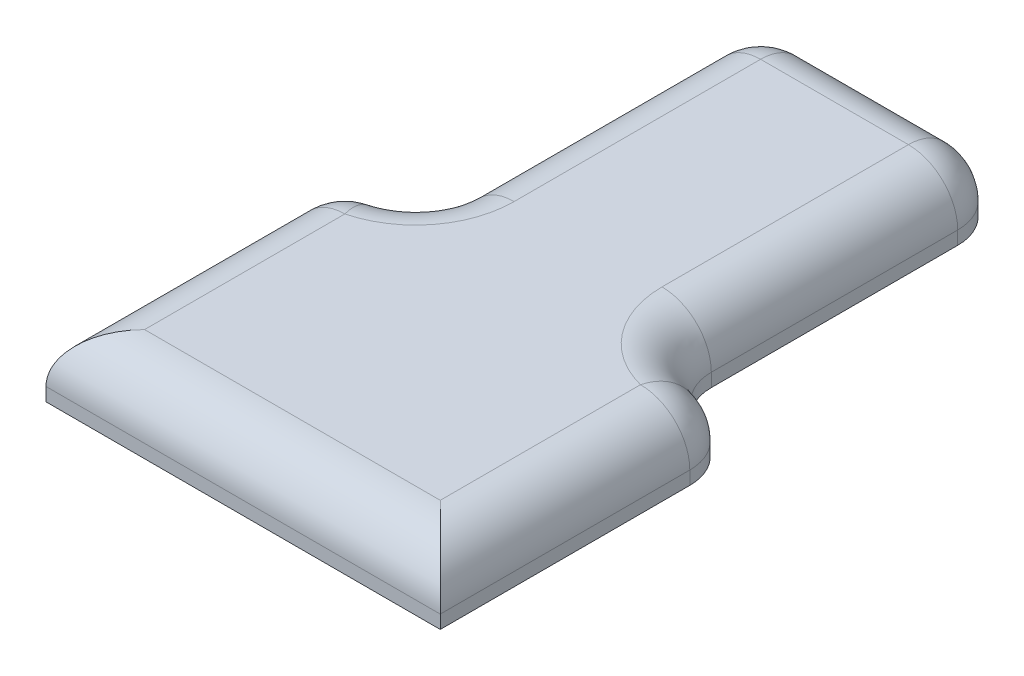
ISO-10303-21;
HEADER;
FILE_DESCRIPTION(('STEP AP214'),'2;1');
FILE_NAME('part.step','',(''),(''),'','','');
FILE_SCHEMA(('AUTOMOTIVE_DESIGN { 1 0 10303 214 1 1 1 1 }'));
ENDSEC;
DATA;
#1=APPLICATION_CONTEXT('core data for automotive mechanical design processes');
#2=APPLICATION_PROTOCOL_DEFINITION('international standard','automotive_design',2000,#1);
#3=PRODUCT_CONTEXT('',#1,'mechanical');
#4=PRODUCT('Part','Part','',(#3));
#5=PRODUCT_RELATED_PRODUCT_CATEGORY('part','',(#4));
#6=PRODUCT_DEFINITION_FORMATION('','',#4);
#7=PRODUCT_DEFINITION_CONTEXT('part definition',#1,'design');
#8=PRODUCT_DEFINITION('design','',#6,#7);
#9=PRODUCT_DEFINITION_SHAPE('','',#8);
#10=(LENGTH_UNIT() NAMED_UNIT(*) SI_UNIT(.MILLI.,.METRE.));
#11=(NAMED_UNIT(*) PLANE_ANGLE_UNIT() SI_UNIT($,.RADIAN.));
#12=(NAMED_UNIT(*) SI_UNIT($,.STERADIAN.) SOLID_ANGLE_UNIT());
#13=UNCERTAINTY_MEASURE_WITH_UNIT(LENGTH_MEASURE(1.E-05),#10,'distance_accuracy_value','');
#14=(GEOMETRIC_REPRESENTATION_CONTEXT(3) GLOBAL_UNCERTAINTY_ASSIGNED_CONTEXT((#13)) GLOBAL_UNIT_ASSIGNED_CONTEXT((#10,
#11,#12)) REPRESENTATION_CONTEXT('',''));
#15=CARTESIAN_POINT('',(0.,0.,0.));
#16=DIRECTION('',(0.,0.,1.));
#17=DIRECTION('',(1.,0.,0.));
#18=AXIS2_PLACEMENT_3D('',#15,#16,#17);
#19=CARTESIAN_POINT('',(15.,2.7,-90.));
#20=DIRECTION('',(0.,0.,1.));
#21=DIRECTION('',(1.,0.,0.));
#22=AXIS2_PLACEMENT_3D('',#19,#20,#21);
#23=SPHERICAL_SURFACE('',#22,10.);
#24=CARTESIAN_POINT('',(15.,2.7,-90.));
#25=DIRECTION('',(0.,-1.,0.));
#26=DIRECTION('',(0.,0.,-1.));
#27=AXIS2_PLACEMENT_3D('',#24,#25,#26);
#28=CIRCLE('',#27,10.);
#29=CARTESIAN_POINT('',(15.,2.7,-100.));
#30=VERTEX_POINT('',#29);
#31=CARTESIAN_POINT('',(25.,2.7,-90.));
#32=VERTEX_POINT('',#31);
#33=EDGE_CURVE('E11',#30,#32,#28,.T.);
#34=ORIENTED_EDGE('',*,*,#33,.F.);
#35=CARTESIAN_POINT('',(15.,2.7,-90.));
#36=DIRECTION('',(1.,0.,0.));
#37=DIRECTION('',(0.,0.,-1.));
#38=AXIS2_PLACEMENT_3D('',#35,#36,#37);
#39=CIRCLE('',#38,10.);
#40=CARTESIAN_POINT('',(15.,12.7,-90.));
#41=VERTEX_POINT('',#40);
#42=EDGE_CURVE('E41',#30,#41,#39,.T.);
#43=ORIENTED_EDGE('',*,*,#42,.T.);
#44=CARTESIAN_POINT('',(15.,2.7,-90.));
#45=DIRECTION('',(0.,0.,-1.));
#46=DIRECTION('',(-1.,0.,0.));
#47=AXIS2_PLACEMENT_3D('',#44,#45,#46);
#48=CIRCLE('',#47,10.);
#49=EDGE_CURVE('E293',#32,#41,#48,.F.);
#50=ORIENTED_EDGE('',*,*,#49,.F.);
#51=EDGE_LOOP('',(#34,#43,#50));
#52=FACE_BOUND('',#51,.T.);
#53=ADVANCED_FACE('F33',(#52),#23,.T.);
#54=CARTESIAN_POINT('',(-25.,2.7,-90.));
#55=DIRECTION('',(-1.,0.,0.));
#56=DIRECTION('',(0.,0.,1.));
#57=AXIS2_PLACEMENT_3D('',#54,#55,#56);
#58=CYLINDRICAL_SURFACE('',#57,10.);
#59=ORIENTED_EDGE('',*,*,#42,.F.);
#60=DIRECTION('',(1.,0.,0.));
#61=VECTOR('',#60,1.);
#62=CARTESIAN_POINT('',(-25.,2.7,-100.));
#63=LINE('',#62,#61);
#64=CARTESIAN_POINT('',(-15.,2.7,-100.));
#65=VERTEX_POINT('',#64);
#66=EDGE_CURVE('E273',#65,#30,#63,.T.);
#67=ORIENTED_EDGE('',*,*,#66,.F.);
#68=CARTESIAN_POINT('',(-15.,2.7,-90.));
#69=DIRECTION('',(1.,0.,0.));
#70=DIRECTION('',(0.,0.,-1.));
#71=AXIS2_PLACEMENT_3D('',#68,#69,#70);
#72=CIRCLE('',#71,10.);
#73=CARTESIAN_POINT('',(-15.,12.7,-90.));
#74=VERTEX_POINT('',#73);
#75=EDGE_CURVE('E299',#65,#74,#72,.T.);
#76=ORIENTED_EDGE('',*,*,#75,.T.);
#77=DIRECTION('',(1.,0.,0.));
#78=VECTOR('',#77,1.);
#79=CARTESIAN_POINT('',(-25.,12.7,-90.));
#80=LINE('',#79,#78);
#81=EDGE_CURVE('E290',#41,#74,#80,.F.);
#82=ORIENTED_EDGE('',*,*,#81,.F.);
#83=EDGE_LOOP('',(#59,#67,#76,#82));
#84=FACE_BOUND('',#83,.T.);
#85=ADVANCED_FACE('F303',(#84),#58,.T.);
#86=CARTESIAN_POINT('',(-15.,2.7,-90.));
#87=DIRECTION('',(0.,0.,1.));
#88=DIRECTION('',(1.,0.,0.));
#89=AXIS2_PLACEMENT_3D('',#86,#87,#88);
#90=SPHERICAL_SURFACE('',#89,10.);
#91=ORIENTED_EDGE('',*,*,#75,.F.);
#92=CARTESIAN_POINT('',(-15.,2.7,-90.));
#93=DIRECTION('',(0.,1.,0.));
#94=DIRECTION('',(0.,0.,1.));
#95=AXIS2_PLACEMENT_3D('',#92,#93,#94);
#96=CIRCLE('',#95,10.);
#97=CARTESIAN_POINT('',(-25.,2.7,-90.));
#98=VERTEX_POINT('',#97);
#99=EDGE_CURVE('E297',#65,#98,#96,.T.);
#100=ORIENTED_EDGE('',*,*,#99,.T.);
#101=CARTESIAN_POINT('',(-15.,2.7,-90.));
#102=DIRECTION('',(0.,0.,1.));
#103=DIRECTION('',(1.,0.,0.));
#104=AXIS2_PLACEMENT_3D('',#101,#102,#103);
#105=CIRCLE('',#104,10.);
#106=EDGE_CURVE('E287',#74,#98,#105,.T.);
#107=ORIENTED_EDGE('',*,*,#106,.F.);
#108=EDGE_LOOP('',(#91,#100,#107));
#109=FACE_BOUND('',#108,.T.);
#110=ADVANCED_FACE('F311',(#109),#90,.T.);
#111=CARTESIAN_POINT('',(-15.,12.7,-90.));
#112=DIRECTION('',(0.,1.,0.));
#113=DIRECTION('',(0.,0.,1.));
#114=AXIS2_PLACEMENT_3D('',#111,#112,#113);
#115=CYLINDRICAL_SURFACE('',#114,10.);
#116=ORIENTED_EDGE('',*,*,#99,.F.);
#117=DIRECTION('',(0.,1.,0.));
#118=VECTOR('',#117,1.);
#119=CARTESIAN_POINT('',(-15.,12.7,-100.));
#120=LINE('',#119,#118);
#121=CARTESIAN_POINT('',(-15.,0.,-100.));
#122=VERTEX_POINT('',#121);
#123=EDGE_CURVE('E276',#122,#65,#120,.T.);
#124=ORIENTED_EDGE('',*,*,#123,.F.);
#125=CARTESIAN_POINT('',(-15.,0.,-90.));
#126=DIRECTION('',(0.,1.,0.));
#127=DIRECTION('',(0.,0.,1.));
#128=AXIS2_PLACEMENT_3D('',#125,#126,#127);
#129=CIRCLE('',#128,10.);
#130=CARTESIAN_POINT('',(-25.,0.,-90.));
#131=VERTEX_POINT('',#130);
#132=EDGE_CURVE('E285',#131,#122,#129,.F.);
#133=ORIENTED_EDGE('',*,*,#132,.F.);
#134=DIRECTION('',(0.,1.,0.));
#135=VECTOR('',#134,1.);
#136=CARTESIAN_POINT('',(-25.,12.7,-90.));
#137=LINE('',#136,#135);
#138=EDGE_CURVE('E279',#98,#131,#137,.F.);
#139=ORIENTED_EDGE('',*,*,#138,.F.);
#140=EDGE_LOOP('',(#116,#124,#133,#139));
#141=FACE_BOUND('',#140,.T.);
#142=ADVANCED_FACE('F389',(#141),#115,.T.);
#143=CARTESIAN_POINT('',(15.,12.7,-90.));
#144=DIRECTION('',(0.,-1.,0.));
#145=DIRECTION('',(0.,0.,-1.));
#146=AXIS2_PLACEMENT_3D('',#143,#144,#145);
#147=CYLINDRICAL_SURFACE('',#146,10.);
#148=DIRECTION('',(0.,-1.,0.));
#149=VECTOR('',#148,1.);
#150=CARTESIAN_POINT('',(15.,12.7,-100.));
#151=LINE('',#150,#149);
#152=CARTESIAN_POINT('',(15.,0.,-100.));
#153=VERTEX_POINT('',#152);
#154=EDGE_CURVE('E270',#30,#153,#151,.T.);
#155=ORIENTED_EDGE('',*,*,#154,.F.);
#156=ORIENTED_EDGE('',*,*,#33,.T.);
#157=DIRECTION('',(0.,-1.,0.));
#158=VECTOR('',#157,1.);
#159=CARTESIAN_POINT('',(25.,12.7,-90.));
#160=LINE('',#159,#158);
#161=CARTESIAN_POINT('',(25.,0.,-90.));
#162=VERTEX_POINT('',#161);
#163=EDGE_CURVE('E295',#162,#32,#160,.F.);
#164=ORIENTED_EDGE('',*,*,#163,.F.);
#165=CARTESIAN_POINT('',(15.,0.,-90.));
#166=DIRECTION('',(0.,1.,0.));
#167=DIRECTION('',(0.,0.,1.));
#168=AXIS2_PLACEMENT_3D('',#165,#166,#167);
#169=CIRCLE('',#168,10.);
#170=EDGE_CURVE('E282',#153,#162,#169,.F.);
#171=ORIENTED_EDGE('',*,*,#170,.F.);
#172=EDGE_LOOP('',(#155,#156,#164,#171));
#173=FACE_BOUND('',#172,.T.);
#174=ADVANCED_FACE('F35',(#173),#147,.T.);
#175=CARTESIAN_POINT('',(30.,2.7,-20.6350832689629));
#176=DIRECTION('',(-0.25,0.,0.968245836551854));
#177=DIRECTION('',(0.968245836551854,0.,0.25));
#178=AXIS2_PLACEMENT_3D('',#175,#176,#177);
#179=SPHERICAL_SURFACE('',#178,10.);
#180=CARTESIAN_POINT('',(30.,2.7,-20.6350832689629));
#181=DIRECTION('',(0.,-1.,0.));
#182=DIRECTION('',(0.,0.,-1.));
#183=AXIS2_PLACEMENT_3D('',#180,#181,#182);
#184=CIRCLE('',#183,10.);
#185=CARTESIAN_POINT('',(32.5,2.7,-30.3175416344815));
#186=VERTEX_POINT('',#185);
#187=CARTESIAN_POINT('',(40.,2.7,-20.6350832689629));
#188=VERTEX_POINT('',#187);
#189=EDGE_CURVE('E268',#186,#188,#184,.T.);
#190=ORIENTED_EDGE('',*,*,#189,.F.);
#191=CARTESIAN_POINT('',(30.,2.7,-20.6350832689629));
#192=DIRECTION('',(0.968245836551854,0.,0.25));
#193=DIRECTION('',(0.25,0.,-0.968245836551854));
#194=AXIS2_PLACEMENT_3D('',#191,#192,#193);
#195=CIRCLE('',#194,10.);
#196=CARTESIAN_POINT('',(30.,12.7,-20.6350832689629));
#197=VERTEX_POINT('',#196);
#198=EDGE_CURVE('E266',#186,#197,#195,.T.);
#199=ORIENTED_EDGE('',*,*,#198,.T.);
#200=CARTESIAN_POINT('',(30.,2.7,-20.6350832689629));
#201=DIRECTION('',(0.,0.,-1.));
#202=DIRECTION('',(-1.,0.,0.));
#203=AXIS2_PLACEMENT_3D('',#200,#201,#202);
#204=CIRCLE('',#203,10.);
#205=EDGE_CURVE('E256',#188,#197,#204,.F.);
#206=ORIENTED_EDGE('',*,*,#205,.F.);
#207=EDGE_LOOP('',(#190,#199,#206));
#208=FACE_BOUND('',#207,.T.);
#209=ADVANCED_FACE('F397',(#208),#179,.T.);
#210=CARTESIAN_POINT('',(35.,2.7,-40.));
#211=DIRECTION('',(0.,1.,0.));
#212=DIRECTION('',(0.,0.,1.));
#213=AXIS2_PLACEMENT_3D('',#210,#211,#212);
#214=TOROIDAL_SURFACE('',#213,20.,10.);
#215=ORIENTED_EDGE('',*,*,#198,.F.);
#216=CARTESIAN_POINT('',(35.,2.7,-40.));
#217=DIRECTION('',(0.,1.,0.));
#218=DIRECTION('',(0.,0.,1.));
#219=AXIS2_PLACEMENT_3D('',#216,#217,#218);
#220=CIRCLE('',#219,10.);
#221=CARTESIAN_POINT('',(25.,2.7,-40.));
#222=VERTEX_POINT('',#221);
#223=EDGE_CURVE('E253',#222,#186,#220,.T.);
#224=ORIENTED_EDGE('',*,*,#223,.F.);
#225=CARTESIAN_POINT('',(15.,2.7,-40.));
#226=DIRECTION('',(0.,0.,1.));
#227=DIRECTION('',(1.,0.,0.));
#228=AXIS2_PLACEMENT_3D('',#225,#226,#227);
#229=CIRCLE('',#228,10.);
#230=CARTESIAN_POINT('',(15.,12.7,-40.));
#231=VERTEX_POINT('',#230);
#232=EDGE_CURVE('E264',#222,#231,#229,.T.);
#233=ORIENTED_EDGE('',*,*,#232,.T.);
#234=CARTESIAN_POINT('',(35.,12.7,-40.));
#235=DIRECTION('',(0.,1.,0.));
#236=DIRECTION('',(0.,0.,1.));
#237=AXIS2_PLACEMENT_3D('',#234,#235,#236);
#238=CIRCLE('',#237,20.);
#239=EDGE_CURVE('E244',#197,#231,#238,.F.);
#240=ORIENTED_EDGE('',*,*,#239,.F.);
#241=EDGE_LOOP('',(#215,#224,#233,#240));
#242=FACE_BOUND('',#241,.T.);
#243=ADVANCED_FACE('F341',(#242),#214,.T.);
#244=CARTESIAN_POINT('',(15.,2.7,-100.));
#245=DIRECTION('',(0.,0.,-1.));
#246=DIRECTION('',(-1.,0.,0.));
#247=AXIS2_PLACEMENT_3D('',#244,#245,#246);
#248=CYLINDRICAL_SURFACE('',#247,10.);
#249=DIRECTION('',(0.,0.,1.));
#250=VECTOR('',#249,1.);
#251=CARTESIAN_POINT('',(25.,2.7,-100.));
#252=LINE('',#251,#250);
#253=EDGE_CURVE('E242',#32,#222,#252,.T.);
#254=ORIENTED_EDGE('',*,*,#253,.F.);
#255=ORIENTED_EDGE('',*,*,#49,.T.);
#256=DIRECTION('',(0.,0.,1.));
#257=VECTOR('',#256,1.);
#258=CARTESIAN_POINT('',(15.,12.7,-100.));
#259=LINE('',#258,#257);
#260=EDGE_CURVE('E247',#231,#41,#259,.F.);
#261=ORIENTED_EDGE('',*,*,#260,.F.);
#262=ORIENTED_EDGE('',*,*,#232,.F.);
#263=EDGE_LOOP('',(#254,#255,#261,#262));
#264=FACE_BOUND('',#263,.T.);
#265=ADVANCED_FACE('F347',(#264),#248,.T.);
#266=CARTESIAN_POINT('',(30.,12.7,-20.6350832689629));
#267=DIRECTION('',(0.,-1.,0.));
#268=DIRECTION('',(0.,0.,-1.));
#269=AXIS2_PLACEMENT_3D('',#266,#267,#268);
#270=CYLINDRICAL_SURFACE('',#269,10.);
#271=DIRECTION('',(0.,-1.,0.));
#272=VECTOR('',#271,1.);
#273=CARTESIAN_POINT('',(32.5,12.7,-30.3175416344815));
#274=LINE('',#273,#272);
#275=CARTESIAN_POINT('',(32.5,0.,-30.3175416344815));
#276=VERTEX_POINT('',#275);
#277=EDGE_CURVE('E250',#186,#276,#274,.T.);
#278=ORIENTED_EDGE('',*,*,#277,.F.);
#279=ORIENTED_EDGE('',*,*,#189,.T.);
#280=DIRECTION('',(0.,-1.,0.));
#281=VECTOR('',#280,1.);
#282=CARTESIAN_POINT('',(40.,12.7,-20.6350832689629));
#283=LINE('',#282,#281);
#284=CARTESIAN_POINT('',(40.,0.,-20.6350832689629));
#285=VERTEX_POINT('',#284);
#286=EDGE_CURVE('E259',#285,#188,#283,.F.);
#287=ORIENTED_EDGE('',*,*,#286,.F.);
#288=CARTESIAN_POINT('',(30.,0.,-20.6350832689629));
#289=DIRECTION('',(0.,1.,0.));
#290=DIRECTION('',(0.,0.,1.));
#291=AXIS2_PLACEMENT_3D('',#288,#289,#290);
#292=CIRCLE('',#291,10.);
#293=EDGE_CURVE('E262',#276,#285,#292,.F.);
#294=ORIENTED_EDGE('',*,*,#293,.F.);
#295=EDGE_LOOP('',(#278,#279,#287,#294));
#296=FACE_BOUND('',#295,.T.);
#297=ADVANCED_FACE('F393',(#296),#270,.T.);
#298=CARTESIAN_POINT('',(-35.,2.7,-40.));
#299=DIRECTION('',(0.,1.,0.));
#300=DIRECTION('',(0.,0.,1.));
#301=AXIS2_PLACEMENT_3D('',#298,#299,#300);
#302=TOROIDAL_SURFACE('',#301,20.,10.);
#303=CARTESIAN_POINT('',(-15.,2.7,-40.));
#304=DIRECTION('',(0.,0.,-1.));
#305=DIRECTION('',(-1.,0.,0.));
#306=AXIS2_PLACEMENT_3D('',#303,#304,#305);
#307=CIRCLE('',#306,10.);
#308=CARTESIAN_POINT('',(-25.,2.7,-40.));
#309=VERTEX_POINT('',#308);
#310=CARTESIAN_POINT('',(-15.,12.7,-40.));
#311=VERTEX_POINT('',#310);
#312=EDGE_CURVE('E239',#309,#311,#307,.T.);
#313=ORIENTED_EDGE('',*,*,#312,.F.);
#314=CARTESIAN_POINT('',(-35.,2.7,-40.));
#315=DIRECTION('',(0.,1.,0.));
#316=DIRECTION('',(0.,0.,1.));
#317=AXIS2_PLACEMENT_3D('',#314,#315,#316);
#318=CIRCLE('',#317,10.);
#319=CARTESIAN_POINT('',(-32.5,2.7,-30.3175416344815));
#320=VERTEX_POINT('',#319);
#321=EDGE_CURVE('E215',#320,#309,#318,.T.);
#322=ORIENTED_EDGE('',*,*,#321,.F.);
#323=CARTESIAN_POINT('',(-30.,2.7,-20.6350832689629));
#324=DIRECTION('',(0.968245836551854,0.,-0.25));
#325=DIRECTION('',(-0.25,0.,-0.968245836551854));
#326=AXIS2_PLACEMENT_3D('',#323,#324,#325);
#327=CIRCLE('',#326,10.);
#328=CARTESIAN_POINT('',(-30.,12.7,-20.6350832689629));
#329=VERTEX_POINT('',#328);
#330=EDGE_CURVE('E237',#320,#329,#327,.T.);
#331=ORIENTED_EDGE('',*,*,#330,.T.);
#332=CARTESIAN_POINT('',(-35.,12.7,-40.));
#333=DIRECTION('',(0.,1.,0.));
#334=DIRECTION('',(0.,0.,1.));
#335=AXIS2_PLACEMENT_3D('',#332,#333,#334);
#336=CIRCLE('',#335,20.);
#337=EDGE_CURVE('E229',#311,#329,#336,.F.);
#338=ORIENTED_EDGE('',*,*,#337,.F.);
#339=EDGE_LOOP('',(#313,#322,#331,#338));
#340=FACE_BOUND('',#339,.T.);
#341=ADVANCED_FACE('F319',(#340),#302,.T.);
#342=CARTESIAN_POINT('',(-30.,2.7,-20.6350832689629));
#343=DIRECTION('',(0.25,0.,0.968245836551854));
#344=DIRECTION('',(0.968245836551854,0.,-0.25));
#345=AXIS2_PLACEMENT_3D('',#342,#343,#344);
#346=SPHERICAL_SURFACE('',#345,10.);
#347=ORIENTED_EDGE('',*,*,#330,.F.);
#348=CARTESIAN_POINT('',(-30.,2.7,-20.6350832689629));
#349=DIRECTION('',(0.,1.,0.));
#350=DIRECTION('',(0.,0.,1.));
#351=AXIS2_PLACEMENT_3D('',#348,#349,#350);
#352=CIRCLE('',#351,10.);
#353=CARTESIAN_POINT('',(-40.,2.7,-20.6350832689629));
#354=VERTEX_POINT('',#353);
#355=EDGE_CURVE('E235',#320,#354,#352,.T.);
#356=ORIENTED_EDGE('',*,*,#355,.T.);
#357=CARTESIAN_POINT('',(-30.,2.7,-20.6350832689629));
#358=DIRECTION('',(0.,0.,1.));
#359=DIRECTION('',(1.,0.,0.));
#360=AXIS2_PLACEMENT_3D('',#357,#358,#359);
#361=CIRCLE('',#360,10.);
#362=EDGE_CURVE('E224',#329,#354,#361,.T.);
#363=ORIENTED_EDGE('',*,*,#362,.F.);
#364=EDGE_LOOP('',(#347,#356,#363));
#365=FACE_BOUND('',#364,.T.);
#366=ADVANCED_FACE('F324',(#365),#346,.T.);
#367=CARTESIAN_POINT('',(-30.,12.7,-20.6350832689629));
#368=DIRECTION('',(0.,1.,0.));
#369=DIRECTION('',(0.,0.,1.));
#370=AXIS2_PLACEMENT_3D('',#367,#368,#369);
#371=CYLINDRICAL_SURFACE('',#370,10.);
#372=ORIENTED_EDGE('',*,*,#355,.F.);
#373=DIRECTION('',(0.,1.,0.));
#374=VECTOR('',#373,1.);
#375=CARTESIAN_POINT('',(-32.5,12.7,-30.3175416344815));
#376=LINE('',#375,#374);
#377=CARTESIAN_POINT('',(-32.5,0.,-30.3175416344815));
#378=VERTEX_POINT('',#377);
#379=EDGE_CURVE('E218',#378,#320,#376,.T.);
#380=ORIENTED_EDGE('',*,*,#379,.F.);
#381=CARTESIAN_POINT('',(-30.,0.,-20.6350832689629));
#382=DIRECTION('',(0.,1.,0.));
#383=DIRECTION('',(0.,0.,1.));
#384=AXIS2_PLACEMENT_3D('',#381,#382,#383);
#385=CIRCLE('',#384,10.);
#386=CARTESIAN_POINT('',(-40.,0.,-20.6350832689629));
#387=VERTEX_POINT('',#386);
#388=EDGE_CURVE('E222',#387,#378,#385,.F.);
#389=ORIENTED_EDGE('',*,*,#388,.F.);
#390=DIRECTION('',(0.,1.,0.));
#391=VECTOR('',#390,1.);
#392=CARTESIAN_POINT('',(-40.,12.7,-20.6350832689629));
#393=LINE('',#392,#391);
#394=EDGE_CURVE('E157',#354,#387,#393,.F.);
#395=ORIENTED_EDGE('',*,*,#394,.F.);
#396=EDGE_LOOP('',(#372,#380,#389,#395));
#397=FACE_BOUND('',#396,.T.);
#398=ADVANCED_FACE('F371',(#397),#371,.T.);
#399=CARTESIAN_POINT('',(-15.,2.7,-100.));
#400=DIRECTION('',(0.,0.,1.));
#401=DIRECTION('',(1.,0.,0.));
#402=AXIS2_PLACEMENT_3D('',#399,#400,#401);
#403=CYLINDRICAL_SURFACE('',#402,10.);
#404=DIRECTION('',(0.,0.,-1.));
#405=VECTOR('',#404,1.);
#406=CARTESIAN_POINT('',(-15.,12.7,-100.));
#407=LINE('',#406,#405);
#408=EDGE_CURVE('E227',#74,#311,#407,.F.);
#409=ORIENTED_EDGE('',*,*,#408,.F.);
#410=ORIENTED_EDGE('',*,*,#106,.T.);
#411=DIRECTION('',(0.,0.,-1.));
#412=VECTOR('',#411,1.);
#413=CARTESIAN_POINT('',(-25.,2.7,-100.));
#414=LINE('',#413,#412);
#415=EDGE_CURVE('E232',#309,#98,#414,.T.);
#416=ORIENTED_EDGE('',*,*,#415,.F.);
#417=ORIENTED_EDGE('',*,*,#312,.T.);
#418=EDGE_LOOP('',(#409,#410,#416,#417));
#419=FACE_BOUND('',#418,.T.);
#420=ADVANCED_FACE('F315',(#419),#403,.T.);
#421=CARTESIAN_POINT('',(-40.,2.7,20.));
#422=DIRECTION('',(1.,0.,0.));
#423=DIRECTION('',(0.,0.,-1.));
#424=AXIS2_PLACEMENT_3D('',#421,#422,#423);
#425=CYLINDRICAL_SURFACE('',#424,10.);
#426=CARTESIAN_POINT('',(-30.,2.7,20.));
#427=DIRECTION('',(0.707106781186547,0.,0.707106781186547));
#428=DIRECTION('',(-0.707106781186547,0.,0.707106781186547));
#429=AXIS2_PLACEMENT_3D('',#426,#427,#428);
#430=ELLIPSE('',#429,14.1421356237309,10.);
#431=CARTESIAN_POINT('',(-40.,2.7,30.));
#432=VERTEX_POINT('',#431);
#433=CARTESIAN_POINT('',(-30.,12.7,20.));
#434=VERTEX_POINT('',#433);
#435=EDGE_CURVE('E213',#432,#434,#430,.F.);
#436=ORIENTED_EDGE('',*,*,#435,.F.);
#437=DIRECTION('',(-1.,0.,0.));
#438=VECTOR('',#437,1.);
#439=CARTESIAN_POINT('',(-40.,2.7,30.));
#440=LINE('',#439,#438);
#441=CARTESIAN_POINT('',(40.,2.7,30.));
#442=VERTEX_POINT('',#441);
#443=EDGE_CURVE('E170',#442,#432,#440,.T.);
#444=ORIENTED_EDGE('',*,*,#443,.F.);
#445=CARTESIAN_POINT('',(30.,2.7,20.));
#446=DIRECTION('',(0.707106781186547,0.,-0.707106781186547));
#447=DIRECTION('',(0.707106781186547,0.,0.707106781186547));
#448=AXIS2_PLACEMENT_3D('',#445,#446,#447);
#449=ELLIPSE('',#448,14.1421356237309,10.);
#450=CARTESIAN_POINT('',(30.,12.7,20.));
#451=VERTEX_POINT('',#450);
#452=EDGE_CURVE('E211',#442,#451,#449,.F.);
#453=ORIENTED_EDGE('',*,*,#452,.T.);
#454=DIRECTION('',(-1.,0.,0.));
#455=VECTOR('',#454,1.);
#456=CARTESIAN_POINT('',(-40.,12.7,20.));
#457=LINE('',#456,#455);
#458=EDGE_CURVE('E197',#434,#451,#457,.F.);
#459=ORIENTED_EDGE('',*,*,#458,.F.);
#460=EDGE_LOOP('',(#436,#444,#453,#459));
#461=FACE_BOUND('',#460,.T.);
#462=ADVANCED_FACE('F332',(#461),#425,.T.);
#463=CARTESIAN_POINT('',(30.,2.7,-30.));
#464=DIRECTION('',(0.,0.,-1.));
#465=DIRECTION('',(-1.,0.,0.));
#466=AXIS2_PLACEMENT_3D('',#463,#464,#465);
#467=CYLINDRICAL_SURFACE('',#466,10.);
#468=DIRECTION('',(0.,0.,1.));
#469=VECTOR('',#468,1.);
#470=CARTESIAN_POINT('',(40.,2.7,-30.));
#471=LINE('',#470,#469);
#472=EDGE_CURVE('E206',#188,#442,#471,.T.);
#473=ORIENTED_EDGE('',*,*,#472,.F.);
#474=ORIENTED_EDGE('',*,*,#205,.T.);
#475=DIRECTION('',(0.,0.,-1.));
#476=VECTOR('',#475,1.);
#477=CARTESIAN_POINT('',(30.,12.7,-30.));
#478=LINE('',#477,#476);
#479=CARTESIAN_POINT('',(30.,12.7,-20.));
#480=VERTEX_POINT('',#479);
#481=EDGE_CURVE('E203',#480,#197,#478,.T.);
#482=ORIENTED_EDGE('',*,*,#481,.F.);
#483=DIRECTION('',(0.,0.,1.));
#484=VECTOR('',#483,1.);
#485=CARTESIAN_POINT('',(30.,12.7,-30.));
#486=LINE('',#485,#484);
#487=EDGE_CURVE('E200',#451,#480,#486,.F.);
#488=ORIENTED_EDGE('',*,*,#487,.F.);
#489=ORIENTED_EDGE('',*,*,#452,.F.);
#490=EDGE_LOOP('',(#473,#474,#482,#488,#489));
#491=FACE_BOUND('',#490,.T.);
#492=ADVANCED_FACE('F336',(#491),#467,.T.);
#493=CARTESIAN_POINT('',(-30.,2.7,-30.));
#494=DIRECTION('',(0.,0.,1.));
#495=DIRECTION('',(1.,0.,0.));
#496=AXIS2_PLACEMENT_3D('',#493,#494,#495);
#497=CYLINDRICAL_SURFACE('',#496,10.);
#498=DIRECTION('',(0.,0.,1.));
#499=VECTOR('',#498,1.);
#500=CARTESIAN_POINT('',(-30.,12.7,-30.));
#501=LINE('',#500,#499);
#502=CARTESIAN_POINT('',(-30.,12.7,-20.));
#503=VERTEX_POINT('',#502);
#504=EDGE_CURVE('E195',#329,#503,#501,.T.);
#505=ORIENTED_EDGE('',*,*,#504,.F.);
#506=ORIENTED_EDGE('',*,*,#362,.T.);
#507=DIRECTION('',(0.,0.,-1.));
#508=VECTOR('',#507,1.);
#509=CARTESIAN_POINT('',(-40.,2.7,-30.));
#510=LINE('',#509,#508);
#511=EDGE_CURVE('E209',#432,#354,#510,.T.);
#512=ORIENTED_EDGE('',*,*,#511,.F.);
#513=ORIENTED_EDGE('',*,*,#435,.T.);
#514=DIRECTION('',(0.,0.,-1.));
#515=VECTOR('',#514,1.);
#516=CARTESIAN_POINT('',(-30.,12.7,-30.));
#517=LINE('',#516,#515);
#518=EDGE_CURVE('E192',#503,#434,#517,.F.);
#519=ORIENTED_EDGE('',*,*,#518,.F.);
#520=EDGE_LOOP('',(#505,#506,#512,#513,#519));
#521=FACE_BOUND('',#520,.T.);
#522=ADVANCED_FACE('F328',(#521),#497,.T.);
#523=CARTESIAN_POINT('',(35.,12.7,-40.));
#524=DIRECTION('',(0.,-1.,0.));
#525=DIRECTION('',(0.,0.,-1.));
#526=AXIS2_PLACEMENT_3D('',#523,#524,#525);
#527=CYLINDRICAL_SURFACE('',#526,10.);
#528=DIRECTION('',(0.,1.,0.));
#529=VECTOR('',#528,1.);
#530=CARTESIAN_POINT('',(25.,12.7,-40.));
#531=LINE('',#530,#529);
#532=CARTESIAN_POINT('',(25.,0.,-40.));
#533=VERTEX_POINT('',#532);
#534=EDGE_CURVE('E187',#222,#533,#531,.F.);
#535=ORIENTED_EDGE('',*,*,#534,.F.);
#536=ORIENTED_EDGE('',*,*,#223,.T.);
#537=ORIENTED_EDGE('',*,*,#277,.T.);
#538=CARTESIAN_POINT('',(35.,0.,-40.));
#539=DIRECTION('',(0.,1.,0.));
#540=DIRECTION('',(0.,0.,1.));
#541=AXIS2_PLACEMENT_3D('',#538,#539,#540);
#542=CIRCLE('',#541,10.);
#543=EDGE_CURVE('E190',#276,#533,#542,.F.);
#544=ORIENTED_EDGE('',*,*,#543,.T.);
#545=EDGE_LOOP('',(#535,#536,#537,#544));
#546=FACE_BOUND('',#545,.T.);
#547=ADVANCED_FACE('F429',(#546),#527,.F.);
#548=CARTESIAN_POINT('',(-35.,12.7,-40.));
#549=DIRECTION('',(0.,1.,0.));
#550=DIRECTION('',(0.,0.,1.));
#551=AXIS2_PLACEMENT_3D('',#548,#549,#550);
#552=CYLINDRICAL_SURFACE('',#551,10.);
#553=CARTESIAN_POINT('',(-35.,0.,-40.));
#554=DIRECTION('',(0.,1.,0.));
#555=DIRECTION('',(0.,0.,1.));
#556=AXIS2_PLACEMENT_3D('',#553,#554,#555);
#557=CIRCLE('',#556,10.);
#558=CARTESIAN_POINT('',(-25.,0.,-40.));
#559=VERTEX_POINT('',#558);
#560=EDGE_CURVE('E184',#559,#378,#557,.F.);
#561=ORIENTED_EDGE('',*,*,#560,.T.);
#562=ORIENTED_EDGE('',*,*,#379,.T.);
#563=ORIENTED_EDGE('',*,*,#321,.T.);
#564=DIRECTION('',(0.,-1.,0.));
#565=VECTOR('',#564,1.);
#566=CARTESIAN_POINT('',(-25.,12.7,-40.));
#567=LINE('',#566,#565);
#568=EDGE_CURVE('E171',#559,#309,#567,.F.);
#569=ORIENTED_EDGE('',*,*,#568,.F.);
#570=EDGE_LOOP('',(#561,#562,#563,#569));
#571=FACE_BOUND('',#570,.T.);
#572=ADVANCED_FACE('F369',(#571),#552,.F.);
#573=CARTESIAN_POINT('',(40.,12.7,-30.));
#574=DIRECTION('',(-1.,0.,0.));
#575=DIRECTION('',(0.,0.,1.));
#576=AXIS2_PLACEMENT_3D('',#573,#574,#575);
#577=PLANE('',#576);
#578=DIRECTION('',(0.,0.,-1.));
#579=VECTOR('',#578,1.);
#580=CARTESIAN_POINT('',(40.,0.,-30.));
#581=LINE('',#580,#579);
#582=CARTESIAN_POINT('',(40.,0.,30.));
#583=VERTEX_POINT('',#582);
#584=EDGE_CURVE('E177',#583,#285,#581,.T.);
#585=ORIENTED_EDGE('',*,*,#584,.T.);
#586=ORIENTED_EDGE('',*,*,#286,.T.);
#587=ORIENTED_EDGE('',*,*,#472,.T.);
#588=DIRECTION('',(0.,-1.,0.));
#589=VECTOR('',#588,1.);
#590=CARTESIAN_POINT('',(40.,12.7,30.));
#591=LINE('',#590,#589);
#592=EDGE_CURVE('E172',#442,#583,#591,.T.);
#593=ORIENTED_EDGE('',*,*,#592,.T.);
#594=EDGE_LOOP('',(#585,#586,#587,#593));
#595=FACE_BOUND('',#594,.T.);
#596=ADVANCED_FACE('F441',(#595),#577,.F.);
#597=CARTESIAN_POINT('',(25.,12.7,-100.));
#598=DIRECTION('',(-1.,0.,0.));
#599=DIRECTION('',(0.,0.,1.));
#600=AXIS2_PLACEMENT_3D('',#597,#598,#599);
#601=PLANE('',#600);
#602=DIRECTION('',(0.,0.,-1.));
#603=VECTOR('',#602,1.);
#604=CARTESIAN_POINT('',(25.,0.,-100.));
#605=LINE('',#604,#603);
#606=EDGE_CURVE('E356',#533,#162,#605,.T.);
#607=ORIENTED_EDGE('',*,*,#606,.T.);
#608=ORIENTED_EDGE('',*,*,#163,.T.);
#609=ORIENTED_EDGE('',*,*,#253,.T.);
#610=ORIENTED_EDGE('',*,*,#534,.T.);
#611=EDGE_LOOP('',(#607,#608,#609,#610));
#612=FACE_BOUND('',#611,.T.);
#613=ADVANCED_FACE('F359',(#612),#601,.F.);
#614=CARTESIAN_POINT('',(-25.,12.7,-100.));
#615=DIRECTION('',(0.,0.,1.));
#616=DIRECTION('',(1.,0.,0.));
#617=AXIS2_PLACEMENT_3D('',#614,#615,#616);
#618=PLANE('',#617);
#619=DIRECTION('',(-1.,0.,0.));
#620=VECTOR('',#619,1.);
#621=CARTESIAN_POINT('',(-25.,0.,-100.));
#622=LINE('',#621,#620);
#623=EDGE_CURVE('E357',#153,#122,#622,.T.);
#624=ORIENTED_EDGE('',*,*,#623,.T.);
#625=ORIENTED_EDGE('',*,*,#123,.T.);
#626=ORIENTED_EDGE('',*,*,#66,.T.);
#627=ORIENTED_EDGE('',*,*,#154,.T.);
#628=EDGE_LOOP('',(#624,#625,#626,#627));
#629=FACE_BOUND('',#628,.T.);
#630=ADVANCED_FACE('F350',(#629),#618,.F.);
#631=CARTESIAN_POINT('',(-25.,12.7,-100.));
#632=DIRECTION('',(1.,0.,0.));
#633=DIRECTION('',(0.,0.,-1.));
#634=AXIS2_PLACEMENT_3D('',#631,#632,#633);
#635=PLANE('',#634);
#636=ORIENTED_EDGE('',*,*,#415,.T.);
#637=ORIENTED_EDGE('',*,*,#138,.T.);
#638=DIRECTION('',(0.,0.,1.));
#639=VECTOR('',#638,1.);
#640=CARTESIAN_POINT('',(-25.,0.,-100.));
#641=LINE('',#640,#639);
#642=EDGE_CURVE('E161',#131,#559,#641,.T.);
#643=ORIENTED_EDGE('',*,*,#642,.T.);
#644=ORIENTED_EDGE('',*,*,#568,.T.);
#645=EDGE_LOOP('',(#636,#637,#643,#644));
#646=FACE_BOUND('',#645,.T.);
#647=ADVANCED_FACE('F365',(#646),#635,.F.);
#648=CARTESIAN_POINT('',(-40.,12.7,-30.));
#649=DIRECTION('',(1.,0.,0.));
#650=DIRECTION('',(0.,0.,-1.));
#651=AXIS2_PLACEMENT_3D('',#648,#649,#650);
#652=PLANE('',#651);
#653=ORIENTED_EDGE('',*,*,#511,.T.);
#654=ORIENTED_EDGE('',*,*,#394,.T.);
#655=DIRECTION('',(0.,0.,1.));
#656=VECTOR('',#655,1.);
#657=CARTESIAN_POINT('',(-40.,0.,-30.));
#658=LINE('',#657,#656);
#659=CARTESIAN_POINT('',(-40.,0.,30.));
#660=VERTEX_POINT('',#659);
#661=EDGE_CURVE('E151',#387,#660,#658,.T.);
#662=ORIENTED_EDGE('',*,*,#661,.T.);
#663=DIRECTION('',(0.,-1.,0.));
#664=VECTOR('',#663,1.);
#665=CARTESIAN_POINT('',(-40.,12.7,30.));
#666=LINE('',#665,#664);
#667=EDGE_CURVE('E155',#432,#660,#666,.T.);
#668=ORIENTED_EDGE('',*,*,#667,.F.);
#669=EDGE_LOOP('',(#653,#654,#662,#668));
#670=FACE_BOUND('',#669,.T.);
#671=ADVANCED_FACE('F154',(#670),#652,.F.);
#672=CARTESIAN_POINT('',(-40.,12.7,30.));
#673=DIRECTION('',(0.,0.,-1.));
#674=DIRECTION('',(-1.,0.,0.));
#675=AXIS2_PLACEMENT_3D('',#672,#673,#674);
#676=PLANE('',#675);
#677=ORIENTED_EDGE('',*,*,#592,.F.);
#678=ORIENTED_EDGE('',*,*,#443,.T.);
#679=ORIENTED_EDGE('',*,*,#667,.T.);
#680=DIRECTION('',(1.,0.,0.));
#681=VECTOR('',#680,1.);
#682=CARTESIAN_POINT('',(-40.,0.,30.));
#683=LINE('',#682,#681);
#684=EDGE_CURVE('E160',#660,#583,#683,.T.);
#685=ORIENTED_EDGE('',*,*,#684,.T.);
#686=EDGE_LOOP('',(#677,#678,#679,#685));
#687=FACE_BOUND('',#686,.T.);
#688=ADVANCED_FACE('F167',(#687),#676,.F.);
#689=CARTESIAN_POINT('',(0.,12.7,0.));
#690=DIRECTION('',(0.,1.,0.));
#691=DIRECTION('',(0.,0.,1.));
#692=AXIS2_PLACEMENT_3D('',#689,#690,#691);
#693=PLANE('',#692);
#694=ORIENTED_EDGE('',*,*,#260,.T.);
#695=ORIENTED_EDGE('',*,*,#81,.T.);
#696=ORIENTED_EDGE('',*,*,#408,.T.);
#697=ORIENTED_EDGE('',*,*,#337,.T.);
#698=ORIENTED_EDGE('',*,*,#504,.T.);
#699=ORIENTED_EDGE('',*,*,#518,.T.);
#700=ORIENTED_EDGE('',*,*,#458,.T.);
#701=ORIENTED_EDGE('',*,*,#487,.T.);
#702=ORIENTED_EDGE('',*,*,#481,.T.);
#703=ORIENTED_EDGE('',*,*,#239,.T.);
#704=EDGE_LOOP('',(#694,#695,#696,#697,#698,#699,#700,#701,#702,#703));
#705=FACE_BOUND('',#704,.T.);
#706=ADVANCED_FACE('F308',(#705),#693,.T.);
#707=CARTESIAN_POINT('',(0.,0.,0.));
#708=DIRECTION('',(0.,1.,0.));
#709=DIRECTION('',(0.,0.,1.));
#710=AXIS2_PLACEMENT_3D('',#707,#708,#709);
#711=PLANE('',#710);
#712=ORIENTED_EDGE('',*,*,#642,.F.);
#713=ORIENTED_EDGE('',*,*,#132,.T.);
#714=ORIENTED_EDGE('',*,*,#623,.F.);
#715=ORIENTED_EDGE('',*,*,#170,.T.);
#716=ORIENTED_EDGE('',*,*,#606,.F.);
#717=ORIENTED_EDGE('',*,*,#543,.F.);
#718=ORIENTED_EDGE('',*,*,#293,.T.);
#719=ORIENTED_EDGE('',*,*,#584,.F.);
#720=ORIENTED_EDGE('',*,*,#684,.F.);
#721=ORIENTED_EDGE('',*,*,#661,.F.);
#722=ORIENTED_EDGE('',*,*,#388,.T.);
#723=ORIENTED_EDGE('',*,*,#560,.F.);
#724=EDGE_LOOP('',(#712,#713,#714,#715,#716,#717,#718,#719,#720,#721,#722,#723));
#725=FACE_BOUND('',#724,.T.);
#726=ADVANCED_FACE('F175',(#725),#711,.F.);
#727=CLOSED_SHELL('',(#53,#85,#110,#142,#174,#209,#243,#265,#297,#341,#366,#398,#420,#462,#492,
#522,#547,#572,#596,#613,#630,#647,#671,#688,#706,#726));
#728=MANIFOLD_SOLID_BREP('B2',#727);
#729=ADVANCED_BREP_SHAPE_REPRESENTATION('',(#18,#728),#14);
#730=SHAPE_DEFINITION_REPRESENTATION(#9,#729);
ENDSEC;
END-ISO-10303-21;
